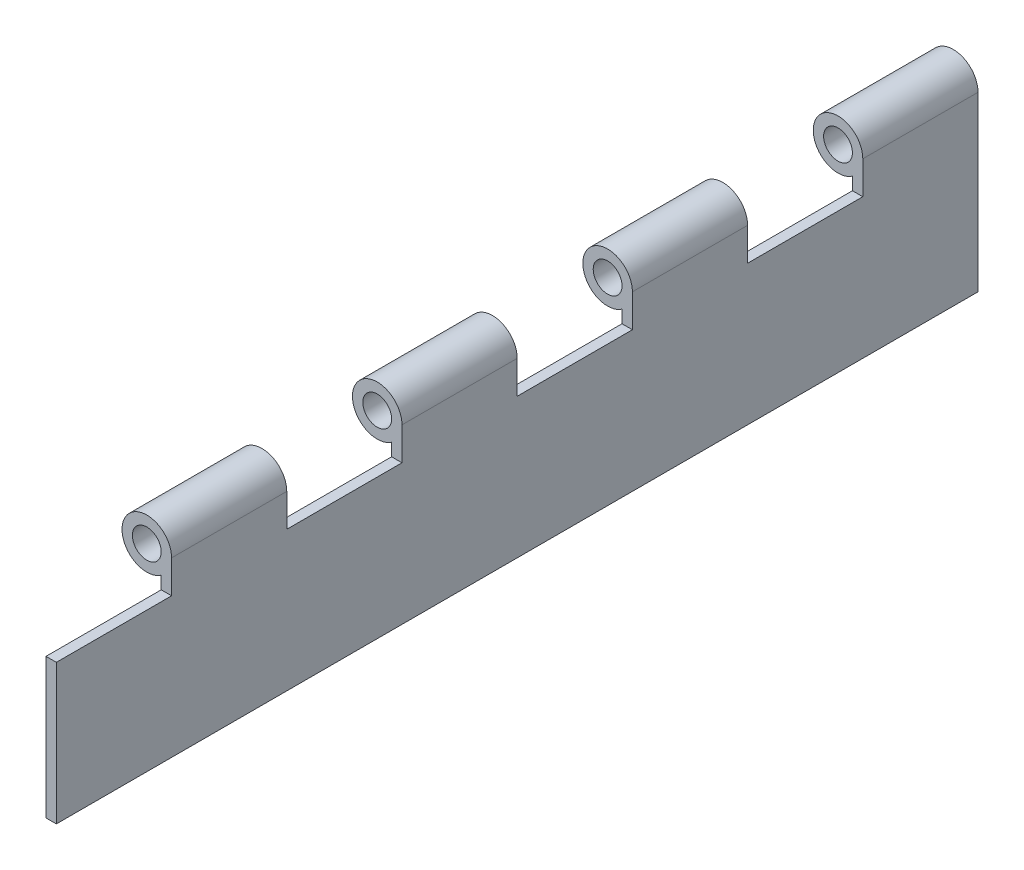
ISO-10303-21;
HEADER;
FILE_DESCRIPTION(('STEP AP214'),'2;1');
FILE_NAME('part.step','',(''),(''),'','','');
FILE_SCHEMA(('AUTOMOTIVE_DESIGN { 1 0 10303 214 1 1 1 1 }'));
ENDSEC;
DATA;
#1=APPLICATION_CONTEXT('core data for automotive mechanical design processes');
#2=APPLICATION_PROTOCOL_DEFINITION('international standard','automotive_design',2000,#1);
#3=PRODUCT_CONTEXT('',#1,'mechanical');
#4=PRODUCT('Part','Part','',(#3));
#5=PRODUCT_RELATED_PRODUCT_CATEGORY('part','',(#4));
#6=PRODUCT_DEFINITION_FORMATION('','',#4);
#7=PRODUCT_DEFINITION_CONTEXT('part definition',#1,'design');
#8=PRODUCT_DEFINITION('design','',#6,#7);
#9=PRODUCT_DEFINITION_SHAPE('','',#8);
#10=(LENGTH_UNIT() NAMED_UNIT(*) SI_UNIT(.MILLI.,.METRE.));
#11=(NAMED_UNIT(*) PLANE_ANGLE_UNIT() SI_UNIT($,.RADIAN.));
#12=(NAMED_UNIT(*) SI_UNIT($,.STERADIAN.) SOLID_ANGLE_UNIT());
#13=UNCERTAINTY_MEASURE_WITH_UNIT(LENGTH_MEASURE(1.E-05),#10,'distance_accuracy_value','');
#14=(GEOMETRIC_REPRESENTATION_CONTEXT(3) GLOBAL_UNCERTAINTY_ASSIGNED_CONTEXT((#13)) GLOBAL_UNIT_ASSIGNED_CONTEXT((#10,
#11,#12)) REPRESENTATION_CONTEXT('',''));
#15=CARTESIAN_POINT('',(0.,0.,0.));
#16=DIRECTION('',(0.,0.,1.));
#17=DIRECTION('',(1.,0.,0.));
#18=AXIS2_PLACEMENT_3D('',#15,#16,#17);
#19=CARTESIAN_POINT('',(0.,0.,203.2));
#20=DIRECTION('',(0.,0.,-1.));
#21=DIRECTION('',(-1.,0.,0.));
#22=AXIS2_PLACEMENT_3D('',#19,#20,#21);
#23=CYLINDRICAL_SURFACE('',#22,5.461);
#24=DIRECTION('',(0.,0.,-1.));
#25=VECTOR('',#24,1.);
#26=CARTESIAN_POINT('',(5.461,0.,203.2));
#27=LINE('',#26,#25);
#28=CARTESIAN_POINT('',(5.461,0.,177.8));
#29=VERTEX_POINT('',#28);
#30=CARTESIAN_POINT('',(5.461,0.,152.4));
#31=VERTEX_POINT('',#30);
#32=EDGE_CURVE('E302',#29,#31,#27,.T.);
#33=ORIENTED_EDGE('',*,*,#32,.T.);
#34=CARTESIAN_POINT('',(0.,0.,152.4));
#35=DIRECTION('',(0.,0.,1.));
#36=DIRECTION('',(1.,0.,0.));
#37=AXIS2_PLACEMENT_3D('',#34,#35,#36);
#38=CIRCLE('',#37,5.461);
#39=CARTESIAN_POINT('',(3.17500000000001,-4.44318534387211,152.4));
#40=VERTEX_POINT('',#39);
#41=EDGE_CURVE('E252',#31,#40,#38,.T.);
#42=ORIENTED_EDGE('',*,*,#41,.T.);
#43=DIRECTION('',(0.,0.,-1.));
#44=VECTOR('',#43,1.);
#45=CARTESIAN_POINT('',(3.17500000000001,-4.44318534387211,203.2));
#46=LINE('',#45,#44);
#47=CARTESIAN_POINT('',(3.17500000000001,-4.44318534387211,177.8));
#48=VERTEX_POINT('',#47);
#49=EDGE_CURVE('E11',#48,#40,#46,.T.);
#50=ORIENTED_EDGE('',*,*,#49,.F.);
#51=CARTESIAN_POINT('',(0.,0.,177.8));
#52=DIRECTION('',(0.,0.,-1.));
#53=DIRECTION('',(-1.,0.,0.));
#54=AXIS2_PLACEMENT_3D('',#51,#52,#53);
#55=CIRCLE('',#54,5.461);
#56=EDGE_CURVE('E276',#48,#29,#55,.T.);
#57=ORIENTED_EDGE('',*,*,#56,.T.);
#58=EDGE_LOOP('',(#33,#42,#50,#57));
#59=FACE_BOUND('',#58,.T.);
#60=ADVANCED_FACE('F43',(#59),#23,.T.);
#61=CARTESIAN_POINT('',(3.17500000000001,-4.44318534387211,127.));
#62=VERTEX_POINT('',#61);
#63=CARTESIAN_POINT('',(3.17500000000001,-4.44318534387211,101.6));
#64=VERTEX_POINT('',#63);
#65=EDGE_CURVE('E52',#62,#64,#46,.T.);
#66=ORIENTED_EDGE('',*,*,#65,.F.);
#67=CARTESIAN_POINT('',(0.,0.,127.));
#68=DIRECTION('',(0.,0.,-1.));
#69=DIRECTION('',(-1.,0.,0.));
#70=AXIS2_PLACEMENT_3D('',#67,#68,#69);
#71=CIRCLE('',#70,5.461);
#72=CARTESIAN_POINT('',(5.461,0.,127.));
#73=VERTEX_POINT('',#72);
#74=EDGE_CURVE('E247',#62,#73,#71,.T.);
#75=ORIENTED_EDGE('',*,*,#74,.T.);
#76=CARTESIAN_POINT('',(5.461,0.,101.6));
#77=VERTEX_POINT('',#76);
#78=EDGE_CURVE('E193',#73,#77,#27,.T.);
#79=ORIENTED_EDGE('',*,*,#78,.T.);
#80=CARTESIAN_POINT('',(0.,0.,101.6));
#81=DIRECTION('',(0.,0.,1.));
#82=DIRECTION('',(1.,0.,0.));
#83=AXIS2_PLACEMENT_3D('',#80,#81,#82);
#84=CIRCLE('',#83,5.461);
#85=EDGE_CURVE('E243',#77,#64,#84,.T.);
#86=ORIENTED_EDGE('',*,*,#85,.T.);
#87=EDGE_LOOP('',(#66,#75,#79,#86));
#88=FACE_BOUND('',#87,.T.);
#89=ADVANCED_FACE('F347',(#88),#23,.T.);
#90=CARTESIAN_POINT('',(3.17500000000001,-4.44318534387211,76.2));
#91=VERTEX_POINT('',#90);
#92=CARTESIAN_POINT('',(3.17500000000001,-4.44318534387211,50.8));
#93=VERTEX_POINT('',#92);
#94=EDGE_CURVE('E378',#91,#93,#46,.T.);
#95=ORIENTED_EDGE('',*,*,#94,.F.);
#96=CARTESIAN_POINT('',(0.,0.,76.2));
#97=DIRECTION('',(0.,0.,-1.));
#98=DIRECTION('',(-1.,0.,0.));
#99=AXIS2_PLACEMENT_3D('',#96,#97,#98);
#100=CIRCLE('',#99,5.461);
#101=CARTESIAN_POINT('',(5.461,0.,76.2));
#102=VERTEX_POINT('',#101);
#103=EDGE_CURVE('E237',#91,#102,#100,.T.);
#104=ORIENTED_EDGE('',*,*,#103,.T.);
#105=CARTESIAN_POINT('',(5.461,0.,50.8));
#106=VERTEX_POINT('',#105);
#107=EDGE_CURVE('E390',#102,#106,#27,.T.);
#108=ORIENTED_EDGE('',*,*,#107,.T.);
#109=CARTESIAN_POINT('',(0.,0.,50.8));
#110=DIRECTION('',(0.,0.,1.));
#111=DIRECTION('',(1.,0.,0.));
#112=AXIS2_PLACEMENT_3D('',#109,#110,#111);
#113=CIRCLE('',#112,5.461);
#114=EDGE_CURVE('E231',#106,#93,#113,.T.);
#115=ORIENTED_EDGE('',*,*,#114,.T.);
#116=EDGE_LOOP('',(#95,#104,#108,#115));
#117=FACE_BOUND('',#116,.T.);
#118=ADVANCED_FACE('F353',(#117),#23,.T.);
#119=CARTESIAN_POINT('',(0.,0.,203.2));
#120=DIRECTION('',(0.,0.,-1.));
#121=DIRECTION('',(-1.,0.,0.));
#122=AXIS2_PLACEMENT_3D('',#119,#120,#121);
#123=CYLINDRICAL_SURFACE('',#122,3.175);
#124=CARTESIAN_POINT('',(0.,0.,152.4));
#125=DIRECTION('',(0.,0.,1.));
#126=DIRECTION('',(1.,0.,0.));
#127=AXIS2_PLACEMENT_3D('',#124,#125,#126);
#128=CIRCLE('',#127,3.175);
#129=CARTESIAN_POINT('',(3.175,0.,152.4));
#130=VERTEX_POINT('',#129);
#131=EDGE_CURVE('E47',#130,#130,#128,.T.);
#132=ORIENTED_EDGE('',*,*,#131,.F.);
#133=EDGE_LOOP('',(#132));
#134=FACE_BOUND('',#133,.T.);
#135=CARTESIAN_POINT('',(0.,0.,177.8));
#136=DIRECTION('',(0.,0.,-1.));
#137=DIRECTION('',(-1.,0.,0.));
#138=AXIS2_PLACEMENT_3D('',#135,#136,#137);
#139=CIRCLE('',#138,3.175);
#140=CARTESIAN_POINT('',(-3.175,0.,177.8));
#141=VERTEX_POINT('',#140);
#142=EDGE_CURVE('E271',#141,#141,#139,.T.);
#143=ORIENTED_EDGE('',*,*,#142,.F.);
#144=EDGE_LOOP('',(#143));
#145=FACE_BOUND('',#144,.T.);
#146=ADVANCED_FACE('F330',(#134,#145),#123,.F.);
#147=CARTESIAN_POINT('',(0.,0.,203.2));
#148=DIRECTION('',(0.,0.,1.));
#149=DIRECTION('',(1.,0.,0.));
#150=AXIS2_PLACEMENT_3D('',#147,#148,#149);
#151=PLANE('',#150);
#152=DIRECTION('',(1.,0.,0.));
#153=VECTOR('',#152,1.);
#154=CARTESIAN_POINT('',(-5.461,-7.239,203.2));
#155=LINE('',#154,#153);
#156=CARTESIAN_POINT('',(3.17500000000001,-7.239,203.2));
#157=VERTEX_POINT('',#156);
#158=CARTESIAN_POINT('',(5.461,-7.239,203.2));
#159=VERTEX_POINT('',#158);
#160=EDGE_CURVE('E268',#157,#159,#155,.T.);
#161=ORIENTED_EDGE('',*,*,#160,.F.);
#162=DIRECTION('',(0.,-1.,0.));
#163=VECTOR('',#162,1.);
#164=CARTESIAN_POINT('',(3.17500000000001,-38.1,203.2));
#165=LINE('',#164,#163);
#166=CARTESIAN_POINT('',(3.17500000000001,-38.1,203.2));
#167=VERTEX_POINT('',#166);
#168=EDGE_CURVE('E285',#157,#167,#165,.T.);
#169=ORIENTED_EDGE('',*,*,#168,.T.);
#170=DIRECTION('',(1.,0.,0.));
#171=VECTOR('',#170,1.);
#172=CARTESIAN_POINT('',(5.461,-38.1,203.2));
#173=LINE('',#172,#171);
#174=CARTESIAN_POINT('',(5.461,-38.1,203.2));
#175=VERTEX_POINT('',#174);
#176=EDGE_CURVE('E287',#167,#175,#173,.T.);
#177=ORIENTED_EDGE('',*,*,#176,.T.);
#178=DIRECTION('',(0.,1.,0.));
#179=VECTOR('',#178,1.);
#180=CARTESIAN_POINT('',(5.461,0.,203.2));
#181=LINE('',#180,#179);
#182=EDGE_CURVE('E290',#175,#159,#181,.T.);
#183=ORIENTED_EDGE('',*,*,#182,.T.);
#184=EDGE_LOOP('',(#161,#169,#177,#183));
#185=FACE_BOUND('',#184,.T.);
#186=ADVANCED_FACE('F366',(#185),#151,.T.);
#187=CARTESIAN_POINT('',(0.,0.,0.));
#188=DIRECTION('',(0.,0.,1.));
#189=DIRECTION('',(1.,0.,0.));
#190=AXIS2_PLACEMENT_3D('',#187,#188,#189);
#191=PLANE('',#190);
#192=CARTESIAN_POINT('',(0.,0.,0.));
#193=DIRECTION('',(0.,0.,1.));
#194=DIRECTION('',(1.,0.,0.));
#195=AXIS2_PLACEMENT_3D('',#192,#193,#194);
#196=CIRCLE('',#195,5.461);
#197=CARTESIAN_POINT('',(5.461,0.,0.));
#198=VERTEX_POINT('',#197);
#199=CARTESIAN_POINT('',(3.17500000000001,-4.44318534387211,0.));
#200=VERTEX_POINT('',#199);
#201=EDGE_CURVE('E284',#198,#200,#196,.T.);
#202=ORIENTED_EDGE('',*,*,#201,.F.);
#203=DIRECTION('',(0.,1.,0.));
#204=VECTOR('',#203,1.);
#205=CARTESIAN_POINT('',(5.461,0.,0.));
#206=LINE('',#205,#204);
#207=CARTESIAN_POINT('',(5.461,-38.1,0.));
#208=VERTEX_POINT('',#207);
#209=EDGE_CURVE('E288',#208,#198,#206,.T.);
#210=ORIENTED_EDGE('',*,*,#209,.F.);
#211=DIRECTION('',(1.,0.,0.));
#212=VECTOR('',#211,1.);
#213=CARTESIAN_POINT('',(5.461,-38.1,0.));
#214=LINE('',#213,#212);
#215=CARTESIAN_POINT('',(3.17500000000001,-38.1,0.));
#216=VERTEX_POINT('',#215);
#217=EDGE_CURVE('E298',#216,#208,#214,.T.);
#218=ORIENTED_EDGE('',*,*,#217,.F.);
#219=DIRECTION('',(0.,-1.,0.));
#220=VECTOR('',#219,1.);
#221=CARTESIAN_POINT('',(3.17500000000001,-38.1,0.));
#222=LINE('',#221,#220);
#223=EDGE_CURVE('E296',#200,#216,#222,.T.);
#224=ORIENTED_EDGE('',*,*,#223,.F.);
#225=EDGE_LOOP('',(#202,#210,#218,#224));
#226=FACE_BOUND('',#225,.T.);
#227=CARTESIAN_POINT('',(0.,0.,0.));
#228=DIRECTION('',(0.,0.,1.));
#229=DIRECTION('',(1.,0.,0.));
#230=AXIS2_PLACEMENT_3D('',#227,#228,#229);
#231=CIRCLE('',#230,3.175);
#232=CARTESIAN_POINT('',(3.175,0.,0.));
#233=VERTEX_POINT('',#232);
#234=EDGE_CURVE('E281',#233,#233,#231,.T.);
#235=ORIENTED_EDGE('',*,*,#234,.T.);
#236=EDGE_LOOP('',(#235));
#237=FACE_BOUND('',#236,.T.);
#238=ADVANCED_FACE('F357',(#226,#237),#191,.F.);
#239=CARTESIAN_POINT('',(3.17500000000001,-4.44318534387211,25.4));
#240=VERTEX_POINT('',#239);
#241=EDGE_CURVE('E54',#240,#200,#46,.T.);
#242=ORIENTED_EDGE('',*,*,#241,.F.);
#243=CARTESIAN_POINT('',(0.,0.,25.4));
#244=DIRECTION('',(0.,0.,-1.));
#245=DIRECTION('',(-1.,0.,0.));
#246=AXIS2_PLACEMENT_3D('',#243,#244,#245);
#247=CIRCLE('',#246,5.461);
#248=CARTESIAN_POINT('',(5.461,0.,25.4));
#249=VERTEX_POINT('',#248);
#250=EDGE_CURVE('E225',#240,#249,#247,.T.);
#251=ORIENTED_EDGE('',*,*,#250,.T.);
#252=EDGE_CURVE('E293',#249,#198,#27,.T.);
#253=ORIENTED_EDGE('',*,*,#252,.T.);
#254=ORIENTED_EDGE('',*,*,#201,.T.);
#255=EDGE_LOOP('',(#242,#251,#253,#254));
#256=FACE_BOUND('',#255,.T.);
#257=ADVANCED_FACE('F45',(#256),#23,.T.);
#258=CARTESIAN_POINT('',(3.17500000000001,-38.1,203.2));
#259=DIRECTION('',(1.,0.,0.));
#260=DIRECTION('',(0.,1.,0.));
#261=AXIS2_PLACEMENT_3D('',#258,#259,#260);
#262=PLANE('',#261);
#263=ORIENTED_EDGE('',*,*,#49,.T.);
#264=DIRECTION('',(0.,-1.,0.));
#265=VECTOR('',#264,1.);
#266=CARTESIAN_POINT('',(3.17500000000001,-38.1,152.4));
#267=LINE('',#266,#265);
#268=CARTESIAN_POINT('',(3.17500000000001,-7.239,152.4));
#269=VERTEX_POINT('',#268);
#270=EDGE_CURVE('E249',#40,#269,#267,.T.);
#271=ORIENTED_EDGE('',*,*,#270,.T.);
#272=DIRECTION('',(0.,0.,-1.));
#273=VECTOR('',#272,1.);
#274=CARTESIAN_POINT('',(3.17500000000001,-7.239,203.2));
#275=LINE('',#274,#273);
#276=CARTESIAN_POINT('',(3.17500000000001,-7.239,127.));
#277=VERTEX_POINT('',#276);
#278=EDGE_CURVE('E260',#269,#277,#275,.T.);
#279=ORIENTED_EDGE('',*,*,#278,.T.);
#280=DIRECTION('',(0.,1.,0.));
#281=VECTOR('',#280,1.);
#282=CARTESIAN_POINT('',(3.17500000000001,-38.1,127.));
#283=LINE('',#282,#281);
#284=EDGE_CURVE('E180',#277,#62,#283,.T.);
#285=ORIENTED_EDGE('',*,*,#284,.T.);
#286=ORIENTED_EDGE('',*,*,#65,.T.);
#287=DIRECTION('',(0.,-1.,0.));
#288=VECTOR('',#287,1.);
#289=CARTESIAN_POINT('',(3.17500000000001,-38.1,101.6));
#290=LINE('',#289,#288);
#291=CARTESIAN_POINT('',(3.17500000000001,-7.239,101.6));
#292=VERTEX_POINT('',#291);
#293=EDGE_CURVE('E240',#64,#292,#290,.T.);
#294=ORIENTED_EDGE('',*,*,#293,.T.);
#295=DIRECTION('',(0.,0.,-1.));
#296=VECTOR('',#295,1.);
#297=CARTESIAN_POINT('',(3.17500000000001,-7.239,203.2));
#298=LINE('',#297,#296);
#299=CARTESIAN_POINT('',(3.17500000000001,-7.239,76.2));
#300=VERTEX_POINT('',#299);
#301=EDGE_CURVE('E257',#292,#300,#298,.T.);
#302=ORIENTED_EDGE('',*,*,#301,.T.);
#303=DIRECTION('',(0.,1.,0.));
#304=VECTOR('',#303,1.);
#305=CARTESIAN_POINT('',(3.17500000000001,-38.1,76.2));
#306=LINE('',#305,#304);
#307=EDGE_CURVE('E234',#300,#91,#306,.T.);
#308=ORIENTED_EDGE('',*,*,#307,.T.);
#309=ORIENTED_EDGE('',*,*,#94,.T.);
#310=DIRECTION('',(0.,-1.,0.));
#311=VECTOR('',#310,1.);
#312=CARTESIAN_POINT('',(3.17500000000001,-38.1,50.8));
#313=LINE('',#312,#311);
#314=CARTESIAN_POINT('',(3.17500000000001,-7.239,50.8));
#315=VERTEX_POINT('',#314);
#316=EDGE_CURVE('E228',#93,#315,#313,.T.);
#317=ORIENTED_EDGE('',*,*,#316,.T.);
#318=DIRECTION('',(0.,0.,-1.));
#319=VECTOR('',#318,1.);
#320=CARTESIAN_POINT('',(3.17500000000001,-7.239,203.2));
#321=LINE('',#320,#319);
#322=CARTESIAN_POINT('',(3.17500000000001,-7.239,25.4));
#323=VERTEX_POINT('',#322);
#324=EDGE_CURVE('E254',#315,#323,#321,.T.);
#325=ORIENTED_EDGE('',*,*,#324,.T.);
#326=DIRECTION('',(0.,1.,0.));
#327=VECTOR('',#326,1.);
#328=CARTESIAN_POINT('',(3.17500000000001,-38.1,25.4));
#329=LINE('',#328,#327);
#330=EDGE_CURVE('E222',#323,#240,#329,.T.);
#331=ORIENTED_EDGE('',*,*,#330,.T.);
#332=ORIENTED_EDGE('',*,*,#241,.T.);
#333=ORIENTED_EDGE('',*,*,#223,.T.);
#334=DIRECTION('',(0.,0.,-1.));
#335=VECTOR('',#334,1.);
#336=CARTESIAN_POINT('',(3.17500000000001,-38.1,203.2));
#337=LINE('',#336,#335);
#338=EDGE_CURVE('E308',#167,#216,#337,.T.);
#339=ORIENTED_EDGE('',*,*,#338,.F.);
#340=ORIENTED_EDGE('',*,*,#168,.F.);
#341=DIRECTION('',(0.,0.,-1.));
#342=VECTOR('',#341,1.);
#343=CARTESIAN_POINT('',(3.17500000000001,-7.239,203.2));
#344=LINE('',#343,#342);
#345=CARTESIAN_POINT('',(3.17500000000001,-7.239,177.8));
#346=VERTEX_POINT('',#345);
#347=EDGE_CURVE('E278',#157,#346,#344,.T.);
#348=ORIENTED_EDGE('',*,*,#347,.T.);
#349=DIRECTION('',(0.,1.,0.));
#350=VECTOR('',#349,1.);
#351=CARTESIAN_POINT('',(3.17500000000001,-38.1,177.8));
#352=LINE('',#351,#350);
#353=EDGE_CURVE('E273',#346,#48,#352,.T.);
#354=ORIENTED_EDGE('',*,*,#353,.T.);
#355=EDGE_LOOP('',(#263,#271,#279,#285,#286,#294,#302,#308,#309,#317,#325,#331,#332,#333,#339,
#340,#348,#354));
#356=FACE_BOUND('',#355,.T.);
#357=ADVANCED_FACE('F356',(#356),#262,.F.);
#358=CARTESIAN_POINT('',(5.461,-38.1,203.2));
#359=DIRECTION('',(0.,1.,0.));
#360=DIRECTION('',(0.,0.,1.));
#361=AXIS2_PLACEMENT_3D('',#358,#359,#360);
#362=PLANE('',#361);
#363=ORIENTED_EDGE('',*,*,#217,.T.);
#364=DIRECTION('',(0.,0.,-1.));
#365=VECTOR('',#364,1.);
#366=CARTESIAN_POINT('',(5.461,-38.1,203.2));
#367=LINE('',#366,#365);
#368=EDGE_CURVE('E305',#175,#208,#367,.T.);
#369=ORIENTED_EDGE('',*,*,#368,.F.);
#370=ORIENTED_EDGE('',*,*,#176,.F.);
#371=ORIENTED_EDGE('',*,*,#338,.T.);
#372=EDGE_LOOP('',(#363,#369,#370,#371));
#373=FACE_BOUND('',#372,.T.);
#374=ADVANCED_FACE('F363',(#373),#362,.F.);
#375=CARTESIAN_POINT('',(5.461,0.,203.2));
#376=DIRECTION('',(-1.,0.,0.));
#377=DIRECTION('',(0.,-1.,0.));
#378=AXIS2_PLACEMENT_3D('',#375,#376,#377);
#379=PLANE('',#378);
#380=DIRECTION('',(0.,0.,-1.));
#381=VECTOR('',#380,1.);
#382=CARTESIAN_POINT('',(5.461,-7.239,152.4));
#383=LINE('',#382,#381);
#384=CARTESIAN_POINT('',(5.461,-7.239,152.4));
#385=VERTEX_POINT('',#384);
#386=CARTESIAN_POINT('',(5.461,-7.239,127.));
#387=VERTEX_POINT('',#386);
#388=EDGE_CURVE('E187',#385,#387,#383,.T.);
#389=ORIENTED_EDGE('',*,*,#388,.F.);
#390=DIRECTION('',(0.,-1.,0.));
#391=VECTOR('',#390,1.);
#392=CARTESIAN_POINT('',(5.461,5.461,152.4));
#393=LINE('',#392,#391);
#394=EDGE_CURVE('E61',#31,#385,#393,.T.);
#395=ORIENTED_EDGE('',*,*,#394,.F.);
#396=ORIENTED_EDGE('',*,*,#32,.F.);
#397=DIRECTION('',(0.,1.,0.));
#398=VECTOR('',#397,1.);
#399=CARTESIAN_POINT('',(5.461,5.461,177.8));
#400=LINE('',#399,#398);
#401=CARTESIAN_POINT('',(5.461,-7.239,177.8));
#402=VERTEX_POINT('',#401);
#403=EDGE_CURVE('E265',#402,#29,#400,.T.);
#404=ORIENTED_EDGE('',*,*,#403,.F.);
#405=DIRECTION('',(0.,0.,-1.));
#406=VECTOR('',#405,1.);
#407=CARTESIAN_POINT('',(5.461,-7.239,203.2));
#408=LINE('',#407,#406);
#409=EDGE_CURVE('E262',#159,#402,#408,.T.);
#410=ORIENTED_EDGE('',*,*,#409,.F.);
#411=ORIENTED_EDGE('',*,*,#182,.F.);
#412=ORIENTED_EDGE('',*,*,#368,.T.);
#413=ORIENTED_EDGE('',*,*,#209,.T.);
#414=ORIENTED_EDGE('',*,*,#252,.F.);
#415=DIRECTION('',(0.,1.,0.));
#416=VECTOR('',#415,1.);
#417=CARTESIAN_POINT('',(5.461,5.461,25.4));
#418=LINE('',#417,#416);
#419=CARTESIAN_POINT('',(5.461,-7.239,25.4));
#420=VERTEX_POINT('',#419);
#421=EDGE_CURVE('E215',#420,#249,#418,.T.);
#422=ORIENTED_EDGE('',*,*,#421,.F.);
#423=DIRECTION('',(0.,0.,-1.));
#424=VECTOR('',#423,1.);
#425=CARTESIAN_POINT('',(5.461,-7.239,50.8));
#426=LINE('',#425,#424);
#427=CARTESIAN_POINT('',(5.461,-7.239,50.8));
#428=VERTEX_POINT('',#427);
#429=EDGE_CURVE('E212',#428,#420,#426,.T.);
#430=ORIENTED_EDGE('',*,*,#429,.F.);
#431=DIRECTION('',(0.,-1.,0.));
#432=VECTOR('',#431,1.);
#433=CARTESIAN_POINT('',(5.461,5.461,50.8));
#434=LINE('',#433,#432);
#435=EDGE_CURVE('E210',#106,#428,#434,.T.);
#436=ORIENTED_EDGE('',*,*,#435,.F.);
#437=ORIENTED_EDGE('',*,*,#107,.F.);
#438=DIRECTION('',(0.,1.,0.));
#439=VECTOR('',#438,1.);
#440=CARTESIAN_POINT('',(5.461,5.461,76.2));
#441=LINE('',#440,#439);
#442=CARTESIAN_POINT('',(5.461,-7.239,76.2));
#443=VERTEX_POINT('',#442);
#444=EDGE_CURVE('E203',#443,#102,#441,.T.);
#445=ORIENTED_EDGE('',*,*,#444,.F.);
#446=DIRECTION('',(0.,0.,-1.));
#447=VECTOR('',#446,1.);
#448=CARTESIAN_POINT('',(5.461,-7.239,101.6));
#449=LINE('',#448,#447);
#450=CARTESIAN_POINT('',(5.461,-7.239,101.6));
#451=VERTEX_POINT('',#450);
#452=EDGE_CURVE('E199',#451,#443,#449,.T.);
#453=ORIENTED_EDGE('',*,*,#452,.F.);
#454=DIRECTION('',(0.,-1.,0.));
#455=VECTOR('',#454,1.);
#456=CARTESIAN_POINT('',(5.461,5.461,101.6));
#457=LINE('',#456,#455);
#458=EDGE_CURVE('E69',#77,#451,#457,.T.);
#459=ORIENTED_EDGE('',*,*,#458,.F.);
#460=ORIENTED_EDGE('',*,*,#78,.F.);
#461=DIRECTION('',(0.,1.,0.));
#462=VECTOR('',#461,1.);
#463=CARTESIAN_POINT('',(5.461,5.461,127.));
#464=LINE('',#463,#462);
#465=EDGE_CURVE('E177',#387,#73,#464,.T.);
#466=ORIENTED_EDGE('',*,*,#465,.F.);
#467=EDGE_LOOP('',(#389,#395,#396,#404,#410,#411,#412,#413,#414,#422,#430,#436,#437,#445,#453,
#459,#460,#466));
#468=FACE_BOUND('',#467,.T.);
#469=ADVANCED_FACE('F191',(#468),#379,.F.);
#470=CARTESIAN_POINT('',(0.,0.,25.4));
#471=DIRECTION('',(0.,0.,-1.));
#472=DIRECTION('',(-1.,0.,0.));
#473=AXIS2_PLACEMENT_3D('',#470,#471,#472);
#474=CIRCLE('',#473,3.175);
#475=CARTESIAN_POINT('',(-3.175,0.,25.4));
#476=VERTEX_POINT('',#475);
#477=EDGE_CURVE('E183',#476,#476,#474,.T.);
#478=ORIENTED_EDGE('',*,*,#477,.F.);
#479=EDGE_LOOP('',(#478));
#480=FACE_BOUND('',#479,.T.);
#481=ORIENTED_EDGE('',*,*,#234,.F.);
#482=EDGE_LOOP('',(#481));
#483=FACE_BOUND('',#482,.T.);
#484=ADVANCED_FACE('F375',(#480,#483),#123,.F.);
#485=CARTESIAN_POINT('',(-5.461,-7.239,203.2));
#486=DIRECTION('',(0.,-1.,0.));
#487=DIRECTION('',(1.,0.,0.));
#488=AXIS2_PLACEMENT_3D('',#485,#486,#487);
#489=PLANE('',#488);
#490=ORIENTED_EDGE('',*,*,#160,.T.);
#491=ORIENTED_EDGE('',*,*,#409,.T.);
#492=DIRECTION('',(1.,0.,0.));
#493=VECTOR('',#492,1.);
#494=CARTESIAN_POINT('',(-5.461,-7.239,177.8));
#495=LINE('',#494,#493);
#496=EDGE_CURVE('E269',#346,#402,#495,.T.);
#497=ORIENTED_EDGE('',*,*,#496,.F.);
#498=ORIENTED_EDGE('',*,*,#347,.F.);
#499=EDGE_LOOP('',(#490,#491,#497,#498));
#500=FACE_BOUND('',#499,.T.);
#501=ADVANCED_FACE('F400',(#500),#489,.F.);
#502=CARTESIAN_POINT('',(-5.461,5.461,177.8));
#503=DIRECTION('',(0.,0.,-1.));
#504=DIRECTION('',(-1.,0.,0.));
#505=AXIS2_PLACEMENT_3D('',#502,#503,#504);
#506=PLANE('',#505);
#507=ORIENTED_EDGE('',*,*,#142,.T.);
#508=EDGE_LOOP('',(#507));
#509=FACE_BOUND('',#508,.T.);
#510=ORIENTED_EDGE('',*,*,#56,.F.);
#511=ORIENTED_EDGE('',*,*,#353,.F.);
#512=ORIENTED_EDGE('',*,*,#496,.T.);
#513=ORIENTED_EDGE('',*,*,#403,.T.);
#514=EDGE_LOOP('',(#510,#511,#512,#513));
#515=FACE_BOUND('',#514,.T.);
#516=ADVANCED_FACE('F405',(#509,#515),#506,.F.);
#517=CARTESIAN_POINT('',(-5.46100000000001,-7.239,50.8));
#518=DIRECTION('',(0.,-1.,0.));
#519=DIRECTION('',(1.,0.,0.));
#520=AXIS2_PLACEMENT_3D('',#517,#518,#519);
#521=PLANE('',#520);
#522=DIRECTION('',(1.,0.,0.));
#523=VECTOR('',#522,1.);
#524=CARTESIAN_POINT('',(-5.46100000000001,-7.239,50.8));
#525=LINE('',#524,#523);
#526=EDGE_CURVE('E218',#315,#428,#525,.T.);
#527=ORIENTED_EDGE('',*,*,#526,.T.);
#528=ORIENTED_EDGE('',*,*,#429,.T.);
#529=DIRECTION('',(1.,0.,0.));
#530=VECTOR('',#529,1.);
#531=CARTESIAN_POINT('',(-5.46100000000001,-7.239,25.4));
#532=LINE('',#531,#530);
#533=EDGE_CURVE('E200',#323,#420,#532,.T.);
#534=ORIENTED_EDGE('',*,*,#533,.F.);
#535=ORIENTED_EDGE('',*,*,#324,.F.);
#536=EDGE_LOOP('',(#527,#528,#534,#535));
#537=FACE_BOUND('',#536,.T.);
#538=ADVANCED_FACE('F422',(#537),#521,.F.);
#539=CARTESIAN_POINT('',(-5.46100000000001,5.461,50.8));
#540=DIRECTION('',(0.,0.,1.));
#541=DIRECTION('',(1.,0.,0.));
#542=AXIS2_PLACEMENT_3D('',#539,#540,#541);
#543=PLANE('',#542);
#544=CARTESIAN_POINT('',(0.,0.,50.8));
#545=DIRECTION('',(0.,0.,1.));
#546=DIRECTION('',(1.,0.,0.));
#547=AXIS2_PLACEMENT_3D('',#544,#545,#546);
#548=CIRCLE('',#547,3.175);
#549=CARTESIAN_POINT('',(3.175,0.,50.8));
#550=VERTEX_POINT('',#549);
#551=EDGE_CURVE('E227',#550,#550,#548,.T.);
#552=ORIENTED_EDGE('',*,*,#551,.T.);
#553=EDGE_LOOP('',(#552));
#554=FACE_BOUND('',#553,.T.);
#555=ORIENTED_EDGE('',*,*,#435,.T.);
#556=ORIENTED_EDGE('',*,*,#526,.F.);
#557=ORIENTED_EDGE('',*,*,#316,.F.);
#558=ORIENTED_EDGE('',*,*,#114,.F.);
#559=EDGE_LOOP('',(#555,#556,#557,#558));
#560=FACE_BOUND('',#559,.T.);
#561=ADVANCED_FACE('F420',(#554,#560),#543,.F.);
#562=CARTESIAN_POINT('',(-5.46100000000001,5.461,25.4));
#563=DIRECTION('',(0.,0.,-1.));
#564=DIRECTION('',(-1.,0.,0.));
#565=AXIS2_PLACEMENT_3D('',#562,#563,#564);
#566=PLANE('',#565);
#567=ORIENTED_EDGE('',*,*,#477,.T.);
#568=EDGE_LOOP('',(#567));
#569=FACE_BOUND('',#568,.T.);
#570=ORIENTED_EDGE('',*,*,#250,.F.);
#571=ORIENTED_EDGE('',*,*,#330,.F.);
#572=ORIENTED_EDGE('',*,*,#533,.T.);
#573=ORIENTED_EDGE('',*,*,#421,.T.);
#574=EDGE_LOOP('',(#570,#571,#572,#573));
#575=FACE_BOUND('',#574,.T.);
#576=ADVANCED_FACE('F425',(#569,#575),#566,.F.);
#577=CARTESIAN_POINT('',(0.,0.,76.2));
#578=DIRECTION('',(0.,0.,-1.));
#579=DIRECTION('',(-1.,0.,0.));
#580=AXIS2_PLACEMENT_3D('',#577,#578,#579);
#581=CIRCLE('',#580,3.175);
#582=CARTESIAN_POINT('',(-3.175,0.,76.2));
#583=VERTEX_POINT('',#582);
#584=EDGE_CURVE('E233',#583,#583,#581,.T.);
#585=ORIENTED_EDGE('',*,*,#584,.F.);
#586=EDGE_LOOP('',(#585));
#587=FACE_BOUND('',#586,.T.);
#588=ORIENTED_EDGE('',*,*,#551,.F.);
#589=EDGE_LOOP('',(#588));
#590=FACE_BOUND('',#589,.T.);
#591=ADVANCED_FACE('F329',(#587,#590),#123,.F.);
#592=CARTESIAN_POINT('',(-5.46100000000001,-7.239,101.6));
#593=DIRECTION('',(0.,-1.,0.));
#594=DIRECTION('',(1.,0.,0.));
#595=AXIS2_PLACEMENT_3D('',#592,#593,#594);
#596=PLANE('',#595);
#597=DIRECTION('',(1.,0.,0.));
#598=VECTOR('',#597,1.);
#599=CARTESIAN_POINT('',(-5.46100000000001,-7.239,101.6));
#600=LINE('',#599,#598);
#601=EDGE_CURVE('E206',#292,#451,#600,.T.);
#602=ORIENTED_EDGE('',*,*,#601,.T.);
#603=ORIENTED_EDGE('',*,*,#452,.T.);
#604=DIRECTION('',(1.,0.,0.));
#605=VECTOR('',#604,1.);
#606=CARTESIAN_POINT('',(-5.46100000000001,-7.239,76.2));
#607=LINE('',#606,#605);
#608=EDGE_CURVE('E207',#300,#443,#607,.T.);
#609=ORIENTED_EDGE('',*,*,#608,.F.);
#610=ORIENTED_EDGE('',*,*,#301,.F.);
#611=EDGE_LOOP('',(#602,#603,#609,#610));
#612=FACE_BOUND('',#611,.T.);
#613=ADVANCED_FACE('F335',(#612),#596,.F.);
#614=CARTESIAN_POINT('',(-5.46100000000001,5.461,101.6));
#615=DIRECTION('',(0.,0.,1.));
#616=DIRECTION('',(1.,0.,0.));
#617=AXIS2_PLACEMENT_3D('',#614,#615,#616);
#618=PLANE('',#617);
#619=CARTESIAN_POINT('',(0.,0.,101.6));
#620=DIRECTION('',(0.,0.,1.));
#621=DIRECTION('',(1.,0.,0.));
#622=AXIS2_PLACEMENT_3D('',#619,#620,#621);
#623=CIRCLE('',#622,3.175);
#624=CARTESIAN_POINT('',(3.175,0.,101.6));
#625=VERTEX_POINT('',#624);
#626=EDGE_CURVE('E239',#625,#625,#623,.T.);
#627=ORIENTED_EDGE('',*,*,#626,.T.);
#628=EDGE_LOOP('',(#627));
#629=FACE_BOUND('',#628,.T.);
#630=ORIENTED_EDGE('',*,*,#458,.T.);
#631=ORIENTED_EDGE('',*,*,#601,.F.);
#632=ORIENTED_EDGE('',*,*,#293,.F.);
#633=ORIENTED_EDGE('',*,*,#85,.F.);
#634=EDGE_LOOP('',(#630,#631,#632,#633));
#635=FACE_BOUND('',#634,.T.);
#636=ADVANCED_FACE('F333',(#629,#635),#618,.F.);
#637=CARTESIAN_POINT('',(-5.46100000000001,5.461,76.2));
#638=DIRECTION('',(0.,0.,-1.));
#639=DIRECTION('',(-1.,0.,0.));
#640=AXIS2_PLACEMENT_3D('',#637,#638,#639);
#641=PLANE('',#640);
#642=ORIENTED_EDGE('',*,*,#584,.T.);
#643=EDGE_LOOP('',(#642));
#644=FACE_BOUND('',#643,.T.);
#645=ORIENTED_EDGE('',*,*,#103,.F.);
#646=ORIENTED_EDGE('',*,*,#307,.F.);
#647=ORIENTED_EDGE('',*,*,#608,.T.);
#648=ORIENTED_EDGE('',*,*,#444,.T.);
#649=EDGE_LOOP('',(#645,#646,#647,#648));
#650=FACE_BOUND('',#649,.T.);
#651=ADVANCED_FACE('F327',(#644,#650),#641,.F.);
#652=CARTESIAN_POINT('',(0.,0.,127.));
#653=DIRECTION('',(0.,0.,-1.));
#654=DIRECTION('',(-1.,0.,0.));
#655=AXIS2_PLACEMENT_3D('',#652,#653,#654);
#656=CIRCLE('',#655,3.175);
#657=CARTESIAN_POINT('',(-3.175,0.,127.));
#658=VERTEX_POINT('',#657);
#659=EDGE_CURVE('E245',#658,#658,#656,.T.);
#660=ORIENTED_EDGE('',*,*,#659,.F.);
#661=EDGE_LOOP('',(#660));
#662=FACE_BOUND('',#661,.T.);
#663=ORIENTED_EDGE('',*,*,#626,.F.);
#664=EDGE_LOOP('',(#663));
#665=FACE_BOUND('',#664,.T.);
#666=ADVANCED_FACE('F324',(#662,#665),#123,.F.);
#667=CARTESIAN_POINT('',(-5.46100000000001,-7.239,152.4));
#668=DIRECTION('',(0.,-1.,0.));
#669=DIRECTION('',(1.,0.,0.));
#670=AXIS2_PLACEMENT_3D('',#667,#668,#669);
#671=PLANE('',#670);
#672=DIRECTION('',(1.,0.,0.));
#673=VECTOR('',#672,1.);
#674=CARTESIAN_POINT('',(-5.46100000000001,-7.239,152.4));
#675=LINE('',#674,#673);
#676=EDGE_CURVE('E184',#269,#385,#675,.T.);
#677=ORIENTED_EDGE('',*,*,#676,.T.);
#678=ORIENTED_EDGE('',*,*,#388,.T.);
#679=DIRECTION('',(1.,0.,0.));
#680=VECTOR('',#679,1.);
#681=CARTESIAN_POINT('',(-5.46100000000001,-7.239,127.));
#682=LINE('',#681,#680);
#683=EDGE_CURVE('E173',#277,#387,#682,.T.);
#684=ORIENTED_EDGE('',*,*,#683,.F.);
#685=ORIENTED_EDGE('',*,*,#278,.F.);
#686=EDGE_LOOP('',(#677,#678,#684,#685));
#687=FACE_BOUND('',#686,.T.);
#688=ADVANCED_FACE('F188',(#687),#671,.F.);
#689=CARTESIAN_POINT('',(-5.46100000000001,5.461,152.4));
#690=DIRECTION('',(0.,0.,1.));
#691=DIRECTION('',(1.,0.,0.));
#692=AXIS2_PLACEMENT_3D('',#689,#690,#691);
#693=PLANE('',#692);
#694=ORIENTED_EDGE('',*,*,#131,.T.);
#695=EDGE_LOOP('',(#694));
#696=FACE_BOUND('',#695,.T.);
#697=ORIENTED_EDGE('',*,*,#394,.T.);
#698=ORIENTED_EDGE('',*,*,#676,.F.);
#699=ORIENTED_EDGE('',*,*,#270,.F.);
#700=ORIENTED_EDGE('',*,*,#41,.F.);
#701=EDGE_LOOP('',(#697,#698,#699,#700));
#702=FACE_BOUND('',#701,.T.);
#703=ADVANCED_FACE('F408',(#696,#702),#693,.F.);
#704=CARTESIAN_POINT('',(-5.46100000000001,5.461,127.));
#705=DIRECTION('',(0.,0.,-1.));
#706=DIRECTION('',(-1.,0.,0.));
#707=AXIS2_PLACEMENT_3D('',#704,#705,#706);
#708=PLANE('',#707);
#709=ORIENTED_EDGE('',*,*,#659,.T.);
#710=EDGE_LOOP('',(#709));
#711=FACE_BOUND('',#710,.T.);
#712=ORIENTED_EDGE('',*,*,#74,.F.);
#713=ORIENTED_EDGE('',*,*,#284,.F.);
#714=ORIENTED_EDGE('',*,*,#683,.T.);
#715=ORIENTED_EDGE('',*,*,#465,.T.);
#716=EDGE_LOOP('',(#712,#713,#714,#715));
#717=FACE_BOUND('',#716,.T.);
#718=ADVANCED_FACE('F175',(#711,#717),#708,.F.);
#719=CLOSED_SHELL('',(#60,#89,#118,#146,#186,#238,#257,#357,#374,#469,#484,#501,#516,#538,#561,
#576,#591,#613,#636,#651,#666,#688,#703,#718));
#720=MANIFOLD_SOLID_BREP('B2',#719);
#721=ADVANCED_BREP_SHAPE_REPRESENTATION('',(#18,#720),#14);
#722=SHAPE_DEFINITION_REPRESENTATION(#9,#721);
ENDSEC;
END-ISO-10303-21;
